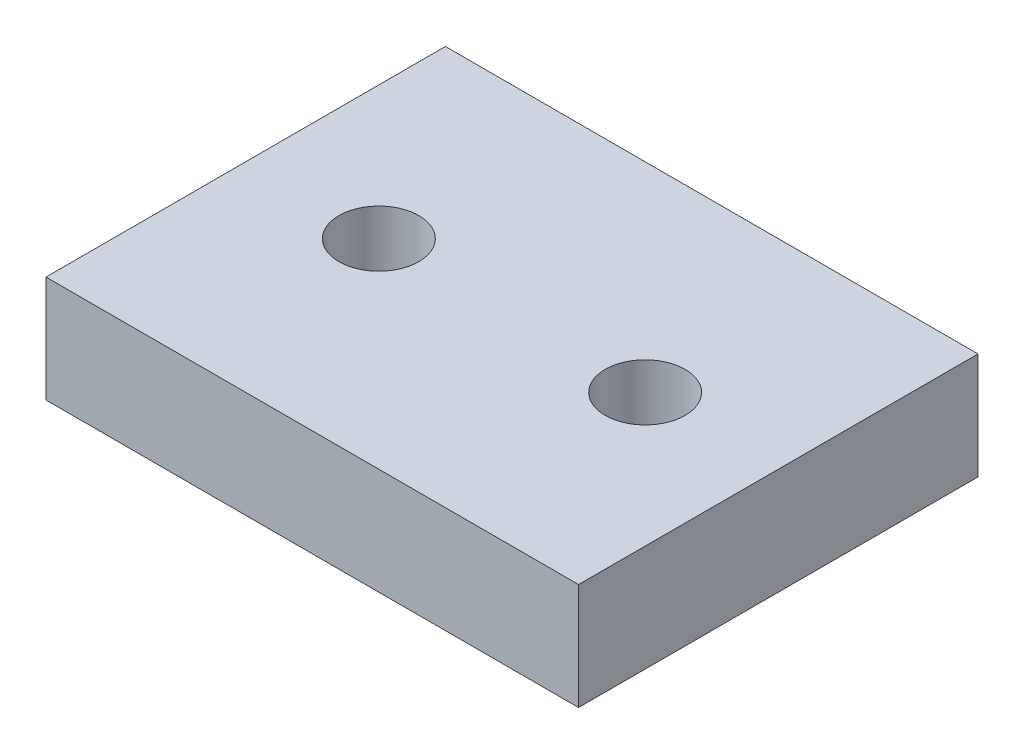
ISO-10303-21;
HEADER;
FILE_DESCRIPTION(('STEP AP214'),'2;1');
FILE_NAME('part.step','',(''),(''),'','','');
FILE_SCHEMA(('AUTOMOTIVE_DESIGN { 1 0 10303 214 1 1 1 1 }'));
ENDSEC;
DATA;
#1=APPLICATION_CONTEXT('core data for automotive mechanical design processes');
#2=APPLICATION_PROTOCOL_DEFINITION('international standard','automotive_design',2000,#1);
#3=PRODUCT_CONTEXT('',#1,'mechanical');
#4=PRODUCT('Part','Part','',(#3));
#5=PRODUCT_RELATED_PRODUCT_CATEGORY('part','',(#4));
#6=PRODUCT_DEFINITION_FORMATION('','',#4);
#7=PRODUCT_DEFINITION_CONTEXT('part definition',#1,'design');
#8=PRODUCT_DEFINITION('design','',#6,#7);
#9=PRODUCT_DEFINITION_SHAPE('','',#8);
#10=(LENGTH_UNIT() NAMED_UNIT(*) SI_UNIT(.MILLI.,.METRE.));
#11=(NAMED_UNIT(*) PLANE_ANGLE_UNIT() SI_UNIT($,.RADIAN.));
#12=(NAMED_UNIT(*) SI_UNIT($,.STERADIAN.) SOLID_ANGLE_UNIT());
#13=UNCERTAINTY_MEASURE_WITH_UNIT(LENGTH_MEASURE(1.E-05),#10,'distance_accuracy_value','');
#14=(GEOMETRIC_REPRESENTATION_CONTEXT(3) GLOBAL_UNCERTAINTY_ASSIGNED_CONTEXT((#13)) GLOBAL_UNIT_ASSIGNED_CONTEXT((#10,
#11,#12)) REPRESENTATION_CONTEXT('',''));
#15=CARTESIAN_POINT('',(0.,0.,0.));
#16=DIRECTION('',(0.,0.,1.));
#17=DIRECTION('',(1.,0.,0.));
#18=AXIS2_PLACEMENT_3D('',#15,#16,#17);
#19=CARTESIAN_POINT('',(20.,4.,0.));
#20=DIRECTION('',(0.,0.,-1.));
#21=DIRECTION('',(0.,1.,0.));
#22=AXIS2_PLACEMENT_3D('',#19,#20,#21);
#23=PLANE('',#22);
#24=DIRECTION('',(0.,-1.,0.));
#25=VECTOR('',#24,1.);
#26=CARTESIAN_POINT('',(0.,4.,0.));
#27=LINE('',#26,#25);
#28=CARTESIAN_POINT('',(0.,4.,0.));
#29=VERTEX_POINT('',#28);
#30=CARTESIAN_POINT('',(0.,0.,0.));
#31=VERTEX_POINT('',#30);
#32=EDGE_CURVE('E102',#29,#31,#27,.T.);
#33=ORIENTED_EDGE('',*,*,#32,.T.);
#34=DIRECTION('',(-1.,0.,0.));
#35=VECTOR('',#34,1.);
#36=CARTESIAN_POINT('',(20.,0.,0.));
#37=LINE('',#36,#35);
#38=CARTESIAN_POINT('',(20.,0.,0.));
#39=VERTEX_POINT('',#38);
#40=EDGE_CURVE('E11',#39,#31,#37,.T.);
#41=ORIENTED_EDGE('',*,*,#40,.F.);
#42=DIRECTION('',(0.,-1.,0.));
#43=VECTOR('',#42,1.);
#44=CARTESIAN_POINT('',(20.,4.,0.));
#45=LINE('',#44,#43);
#46=CARTESIAN_POINT('',(20.,4.,0.));
#47=VERTEX_POINT('',#46);
#48=EDGE_CURVE('E90',#47,#39,#45,.T.);
#49=ORIENTED_EDGE('',*,*,#48,.F.);
#50=DIRECTION('',(-1.,0.,0.));
#51=VECTOR('',#50,1.);
#52=CARTESIAN_POINT('',(20.,4.,0.));
#53=LINE('',#52,#51);
#54=EDGE_CURVE('E98',#47,#29,#53,.T.);
#55=ORIENTED_EDGE('',*,*,#54,.T.);
#56=EDGE_LOOP('',(#33,#41,#49,#55));
#57=FACE_BOUND('',#56,.T.);
#58=ADVANCED_FACE('F39',(#57),#23,.F.);
#59=CARTESIAN_POINT('',(20.,0.,0.));
#60=DIRECTION('',(0.,1.,0.));
#61=DIRECTION('',(0.,0.,1.));
#62=AXIS2_PLACEMENT_3D('',#59,#60,#61);
#63=PLANE('',#62);
#64=CARTESIAN_POINT('',(5.,0.,-7.5));
#65=DIRECTION('',(0.,1.,0.));
#66=DIRECTION('',(0.,0.,1.));
#67=AXIS2_PLACEMENT_3D('',#64,#65,#66);
#68=CIRCLE('',#67,1.5);
#69=CARTESIAN_POINT('',(5.,0.,-6.));
#70=VERTEX_POINT('',#69);
#71=EDGE_CURVE('E105',#70,#70,#68,.T.);
#72=ORIENTED_EDGE('',*,*,#71,.T.);
#73=EDGE_LOOP('',(#72));
#74=FACE_BOUND('',#73,.T.);
#75=CARTESIAN_POINT('',(15.,0.,-7.5));
#76=DIRECTION('',(0.,1.,0.));
#77=DIRECTION('',(0.,0.,1.));
#78=AXIS2_PLACEMENT_3D('',#75,#76,#77);
#79=CIRCLE('',#78,1.5);
#80=CARTESIAN_POINT('',(15.,0.,-6.));
#81=VERTEX_POINT('',#80);
#82=EDGE_CURVE('E116',#81,#81,#79,.T.);
#83=ORIENTED_EDGE('',*,*,#82,.T.);
#84=EDGE_LOOP('',(#83));
#85=FACE_BOUND('',#84,.T.);
#86=DIRECTION('',(0.,0.,-1.));
#87=VECTOR('',#86,1.);
#88=CARTESIAN_POINT('',(0.,0.,0.));
#89=LINE('',#88,#87);
#90=CARTESIAN_POINT('',(0.,0.,-15.));
#91=VERTEX_POINT('',#90);
#92=EDGE_CURVE('E94',#31,#91,#89,.T.);
#93=ORIENTED_EDGE('',*,*,#92,.T.);
#94=DIRECTION('',(-1.,0.,0.));
#95=VECTOR('',#94,1.);
#96=CARTESIAN_POINT('',(20.,0.,-15.));
#97=LINE('',#96,#95);
#98=CARTESIAN_POINT('',(20.,0.,-15.));
#99=VERTEX_POINT('',#98);
#100=EDGE_CURVE('E47',#99,#91,#97,.T.);
#101=ORIENTED_EDGE('',*,*,#100,.F.);
#102=DIRECTION('',(0.,0.,-1.));
#103=VECTOR('',#102,1.);
#104=CARTESIAN_POINT('',(20.,0.,0.));
#105=LINE('',#104,#103);
#106=EDGE_CURVE('E85',#39,#99,#105,.T.);
#107=ORIENTED_EDGE('',*,*,#106,.F.);
#108=ORIENTED_EDGE('',*,*,#40,.T.);
#109=EDGE_LOOP('',(#93,#101,#107,#108));
#110=FACE_BOUND('',#109,.T.);
#111=ADVANCED_FACE('F93',(#74,#85,#110),#63,.F.);
#112=CARTESIAN_POINT('',(20.,0.,-15.));
#113=DIRECTION('',(0.,0.,1.));
#114=DIRECTION('',(1.,0.,0.));
#115=AXIS2_PLACEMENT_3D('',#112,#113,#114);
#116=PLANE('',#115);
#117=DIRECTION('',(0.,1.,0.));
#118=VECTOR('',#117,1.);
#119=CARTESIAN_POINT('',(0.,0.,-15.));
#120=LINE('',#119,#118);
#121=CARTESIAN_POINT('',(0.,4.,-15.));
#122=VERTEX_POINT('',#121);
#123=EDGE_CURVE('E72',#91,#122,#120,.T.);
#124=ORIENTED_EDGE('',*,*,#123,.T.);
#125=DIRECTION('',(-1.,0.,0.));
#126=VECTOR('',#125,1.);
#127=CARTESIAN_POINT('',(20.,4.,-15.));
#128=LINE('',#127,#126);
#129=CARTESIAN_POINT('',(20.,4.,-15.));
#130=VERTEX_POINT('',#129);
#131=EDGE_CURVE('E95',#130,#122,#128,.T.);
#132=ORIENTED_EDGE('',*,*,#131,.F.);
#133=DIRECTION('',(0.,1.,0.));
#134=VECTOR('',#133,1.);
#135=CARTESIAN_POINT('',(20.,0.,-15.));
#136=LINE('',#135,#134);
#137=EDGE_CURVE('E88',#99,#130,#136,.T.);
#138=ORIENTED_EDGE('',*,*,#137,.F.);
#139=ORIENTED_EDGE('',*,*,#100,.T.);
#140=EDGE_LOOP('',(#124,#132,#138,#139));
#141=FACE_BOUND('',#140,.T.);
#142=ADVANCED_FACE('F96',(#141),#116,.F.);
#143=CARTESIAN_POINT('',(20.,4.,-15.));
#144=DIRECTION('',(0.,-1.,0.));
#145=DIRECTION('',(0.,0.,-1.));
#146=AXIS2_PLACEMENT_3D('',#143,#144,#145);
#147=PLANE('',#146);
#148=CARTESIAN_POINT('',(5.,4.,-7.5));
#149=DIRECTION('',(0.,1.,0.));
#150=DIRECTION('',(0.,0.,1.));
#151=AXIS2_PLACEMENT_3D('',#148,#149,#150);
#152=CIRCLE('',#151,1.5);
#153=CARTESIAN_POINT('',(5.,4.,-6.));
#154=VERTEX_POINT('',#153);
#155=EDGE_CURVE('E122',#154,#154,#152,.T.);
#156=ORIENTED_EDGE('',*,*,#155,.F.);
#157=EDGE_LOOP('',(#156));
#158=FACE_BOUND('',#157,.T.);
#159=CARTESIAN_POINT('',(15.,4.,-7.5));
#160=DIRECTION('',(0.,1.,0.));
#161=DIRECTION('',(0.,0.,1.));
#162=AXIS2_PLACEMENT_3D('',#159,#160,#161);
#163=CIRCLE('',#162,1.5);
#164=CARTESIAN_POINT('',(15.,4.,-6.));
#165=VERTEX_POINT('',#164);
#166=EDGE_CURVE('E119',#165,#165,#163,.T.);
#167=ORIENTED_EDGE('',*,*,#166,.F.);
#168=EDGE_LOOP('',(#167));
#169=FACE_BOUND('',#168,.T.);
#170=DIRECTION('',(0.,0.,1.));
#171=VECTOR('',#170,1.);
#172=CARTESIAN_POINT('',(0.,4.,-15.));
#173=LINE('',#172,#171);
#174=EDGE_CURVE('E78',#122,#29,#173,.T.);
#175=ORIENTED_EDGE('',*,*,#174,.T.);
#176=ORIENTED_EDGE('',*,*,#54,.F.);
#177=DIRECTION('',(0.,0.,1.));
#178=VECTOR('',#177,1.);
#179=CARTESIAN_POINT('',(20.,4.,-15.));
#180=LINE('',#179,#178);
#181=EDGE_CURVE('E55',#130,#47,#180,.T.);
#182=ORIENTED_EDGE('',*,*,#181,.F.);
#183=ORIENTED_EDGE('',*,*,#131,.T.);
#184=EDGE_LOOP('',(#175,#176,#182,#183));
#185=FACE_BOUND('',#184,.T.);
#186=ADVANCED_FACE('F110',(#158,#169,#185),#147,.F.);
#187=CARTESIAN_POINT('',(20.,0.,0.));
#188=DIRECTION('',(1.,0.,0.));
#189=DIRECTION('',(0.,0.,-1.));
#190=AXIS2_PLACEMENT_3D('',#187,#188,#189);
#191=PLANE('',#190);
#192=ORIENTED_EDGE('',*,*,#48,.T.);
#193=ORIENTED_EDGE('',*,*,#106,.T.);
#194=ORIENTED_EDGE('',*,*,#137,.T.);
#195=ORIENTED_EDGE('',*,*,#181,.T.);
#196=EDGE_LOOP('',(#192,#193,#194,#195));
#197=FACE_BOUND('',#196,.T.);
#198=ADVANCED_FACE('F86',(#197),#191,.T.);
#199=CARTESIAN_POINT('',(0.,0.,0.));
#200=DIRECTION('',(1.,0.,0.));
#201=DIRECTION('',(0.,0.,-1.));
#202=AXIS2_PLACEMENT_3D('',#199,#200,#201);
#203=PLANE('',#202);
#204=ORIENTED_EDGE('',*,*,#32,.F.);
#205=ORIENTED_EDGE('',*,*,#174,.F.);
#206=ORIENTED_EDGE('',*,*,#123,.F.);
#207=ORIENTED_EDGE('',*,*,#92,.F.);
#208=EDGE_LOOP('',(#204,#205,#206,#207));
#209=FACE_BOUND('',#208,.T.);
#210=ADVANCED_FACE('F113',(#209),#203,.F.);
#211=CARTESIAN_POINT('',(15.,0.,-7.5));
#212=DIRECTION('',(0.,1.,0.));
#213=DIRECTION('',(0.,0.,1.));
#214=AXIS2_PLACEMENT_3D('',#211,#212,#213);
#215=CYLINDRICAL_SURFACE('',#214,1.5);
#216=ORIENTED_EDGE('',*,*,#82,.F.);
#217=EDGE_LOOP('',(#216));
#218=FACE_BOUND('',#217,.T.);
#219=ORIENTED_EDGE('',*,*,#166,.T.);
#220=EDGE_LOOP('',(#219));
#221=FACE_BOUND('',#220,.T.);
#222=ADVANCED_FACE('F133',(#218,#221),#215,.F.);
#223=CARTESIAN_POINT('',(5.,0.,-7.5));
#224=DIRECTION('',(0.,1.,0.));
#225=DIRECTION('',(0.,0.,1.));
#226=AXIS2_PLACEMENT_3D('',#223,#224,#225);
#227=CYLINDRICAL_SURFACE('',#226,1.5);
#228=ORIENTED_EDGE('',*,*,#71,.F.);
#229=EDGE_LOOP('',(#228));
#230=FACE_BOUND('',#229,.T.);
#231=ORIENTED_EDGE('',*,*,#155,.T.);
#232=EDGE_LOOP('',(#231));
#233=FACE_BOUND('',#232,.T.);
#234=ADVANCED_FACE('F130',(#230,#233),#227,.F.);
#235=CLOSED_SHELL('',(#58,#111,#142,#186,#198,#210,#222,#234));
#236=MANIFOLD_SOLID_BREP('B2',#235);
#237=ADVANCED_BREP_SHAPE_REPRESENTATION('',(#18,#236),#14);
#238=SHAPE_DEFINITION_REPRESENTATION(#9,#237);
ENDSEC;
END-ISO-10303-21;
